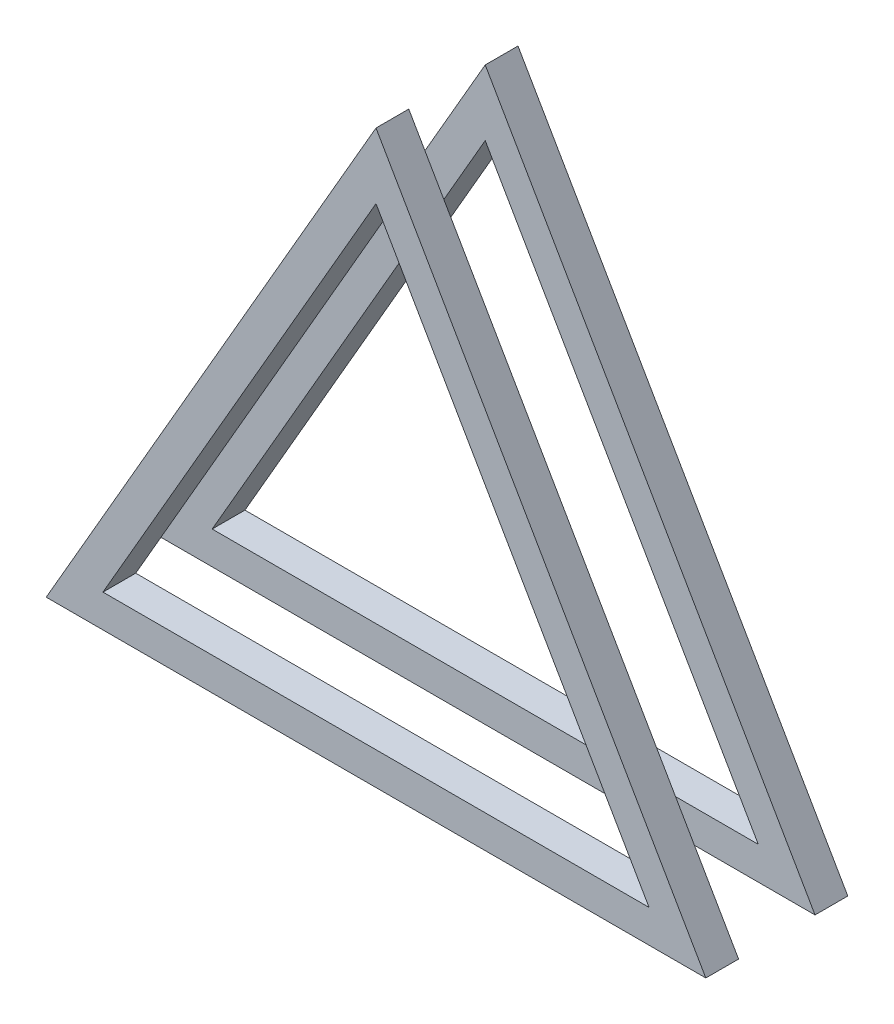
ISO-10303-21;
HEADER;
FILE_DESCRIPTION(('STEP AP214'),'2;1');
FILE_NAME('part.step','',(''),(''),'','','');
FILE_SCHEMA(('AUTOMOTIVE_DESIGN { 1 0 10303 214 1 1 1 1 }'));
ENDSEC;
DATA;
#1=APPLICATION_CONTEXT('core data for automotive mechanical design processes');
#2=APPLICATION_PROTOCOL_DEFINITION('international standard','automotive_design',2000,#1);
#3=PRODUCT_CONTEXT('',#1,'mechanical');
#4=PRODUCT('Part','Part','',(#3));
#5=PRODUCT_RELATED_PRODUCT_CATEGORY('part','',(#4));
#6=PRODUCT_DEFINITION_FORMATION('','',#4);
#7=PRODUCT_DEFINITION_CONTEXT('part definition',#1,'design');
#8=PRODUCT_DEFINITION('design','',#6,#7);
#9=PRODUCT_DEFINITION_SHAPE('','',#8);
#10=(LENGTH_UNIT() NAMED_UNIT(*) SI_UNIT(.MILLI.,.METRE.));
#11=(NAMED_UNIT(*) PLANE_ANGLE_UNIT() SI_UNIT($,.RADIAN.));
#12=(NAMED_UNIT(*) SI_UNIT($,.STERADIAN.) SOLID_ANGLE_UNIT());
#13=UNCERTAINTY_MEASURE_WITH_UNIT(LENGTH_MEASURE(1.E-05),#10,'distance_accuracy_value','');
#14=(GEOMETRIC_REPRESENTATION_CONTEXT(3) GLOBAL_UNCERTAINTY_ASSIGNED_CONTEXT((#13)) GLOBAL_UNIT_ASSIGNED_CONTEXT((#10,
#11,#12)) REPRESENTATION_CONTEXT('',''));
#15=CARTESIAN_POINT('',(0.,0.,0.));
#16=DIRECTION('',(0.,0.,1.));
#17=DIRECTION('',(1.,0.,0.));
#18=AXIS2_PLACEMENT_3D('',#15,#16,#17);
#19=CARTESIAN_POINT('',(0.,0.,-7.));
#20=DIRECTION('',(0.,0.,1.));
#21=DIRECTION('',(1.,0.,0.));
#22=AXIS2_PLACEMENT_3D('',#19,#20,#21);
#23=PLANE('',#22);
#24=DIRECTION('',(1.,0.,0.));
#25=VECTOR('',#24,1.);
#26=CARTESIAN_POINT('',(-5.19615242270663,-3.,-7.));
#27=LINE('',#26,#25);
#28=CARTESIAN_POINT('',(-5.19615242270663,-3.,-7.));
#29=VERTEX_POINT('',#28);
#30=CARTESIAN_POINT('',(55.1961524227066,-3.,-7.));
#31=VERTEX_POINT('',#30);
#32=EDGE_CURVE('E123',#29,#31,#27,.T.);
#33=ORIENTED_EDGE('',*,*,#32,.T.);
#34=DIRECTION('',(-0.5,0.866025403784439,0.));
#35=VECTOR('',#34,1.);
#36=CARTESIAN_POINT('',(55.1961524227066,-3.,-7.));
#37=LINE('',#36,#35);
#38=CARTESIAN_POINT('',(25.,49.3012701892219,-7.));
#39=VERTEX_POINT('',#38);
#40=EDGE_CURVE('E126',#31,#39,#37,.T.);
#41=ORIENTED_EDGE('',*,*,#40,.T.);
#42=DIRECTION('',(-0.5,-0.866025403784439,0.));
#43=VECTOR('',#42,1.);
#44=CARTESIAN_POINT('',(25.,49.3012701892219,-7.));
#45=LINE('',#44,#43);
#46=EDGE_CURVE('E129',#39,#29,#45,.T.);
#47=ORIENTED_EDGE('',*,*,#46,.T.);
#48=EDGE_LOOP('',(#33,#41,#47));
#49=FACE_BOUND('',#48,.T.);
#50=DIRECTION('',(1.,0.,0.));
#51=VECTOR('',#50,1.);
#52=CARTESIAN_POINT('',(0.,0.,-7.));
#53=LINE('',#52,#51);
#54=CARTESIAN_POINT('',(0.,0.,-7.));
#55=VERTEX_POINT('',#54);
#56=CARTESIAN_POINT('',(50.,0.,-7.));
#57=VERTEX_POINT('',#56);
#58=EDGE_CURVE('E104',#55,#57,#53,.T.);
#59=ORIENTED_EDGE('',*,*,#58,.F.);
#60=DIRECTION('',(-0.5,-0.866025403784439,0.));
#61=VECTOR('',#60,1.);
#62=CARTESIAN_POINT('',(25.,43.3012701892219,-7.));
#63=LINE('',#62,#61);
#64=CARTESIAN_POINT('',(25.,43.3012701892219,-7.));
#65=VERTEX_POINT('',#64);
#66=EDGE_CURVE('E96',#65,#55,#63,.T.);
#67=ORIENTED_EDGE('',*,*,#66,.F.);
#68=DIRECTION('',(-0.5,0.866025403784439,0.));
#69=VECTOR('',#68,1.);
#70=CARTESIAN_POINT('',(50.,0.,-7.));
#71=LINE('',#70,#69);
#72=EDGE_CURVE('E113',#57,#65,#71,.T.);
#73=ORIENTED_EDGE('',*,*,#72,.F.);
#74=EDGE_LOOP('',(#59,#67,#73));
#75=FACE_BOUND('',#74,.T.);
#76=ADVANCED_FACE('F43',(#49,#75),#23,.T.);
#77=CARTESIAN_POINT('',(0.,0.,-10.));
#78=DIRECTION('',(0.,0.,1.));
#79=DIRECTION('',(1.,0.,0.));
#80=AXIS2_PLACEMENT_3D('',#77,#78,#79);
#81=PLANE('',#80);
#82=DIRECTION('',(1.,0.,0.));
#83=VECTOR('',#82,1.);
#84=CARTESIAN_POINT('',(-5.19615242270663,-3.,-10.));
#85=LINE('',#84,#83);
#86=CARTESIAN_POINT('',(-5.19615242270663,-3.,-10.));
#87=VERTEX_POINT('',#86);
#88=CARTESIAN_POINT('',(55.1961524227066,-3.,-10.));
#89=VERTEX_POINT('',#88);
#90=EDGE_CURVE('E111',#87,#89,#85,.T.);
#91=ORIENTED_EDGE('',*,*,#90,.F.);
#92=DIRECTION('',(-0.5,-0.866025403784439,0.));
#93=VECTOR('',#92,1.);
#94=CARTESIAN_POINT('',(25.,49.3012701892219,-10.));
#95=LINE('',#94,#93);
#96=CARTESIAN_POINT('',(25.,49.3012701892219,-10.));
#97=VERTEX_POINT('',#96);
#98=EDGE_CURVE('E127',#97,#87,#95,.T.);
#99=ORIENTED_EDGE('',*,*,#98,.F.);
#100=DIRECTION('',(-0.5,0.866025403784439,0.));
#101=VECTOR('',#100,1.);
#102=CARTESIAN_POINT('',(55.1961524227066,-3.,-10.));
#103=LINE('',#102,#101);
#104=EDGE_CURVE('E134',#89,#97,#103,.T.);
#105=ORIENTED_EDGE('',*,*,#104,.F.);
#106=EDGE_LOOP('',(#91,#99,#105));
#107=FACE_BOUND('',#106,.T.);
#108=DIRECTION('',(-0.5,-0.866025403784439,0.));
#109=VECTOR('',#108,1.);
#110=CARTESIAN_POINT('',(25.,43.3012701892219,-10.));
#111=LINE('',#110,#109);
#112=CARTESIAN_POINT('',(25.,43.3012701892219,-10.));
#113=VERTEX_POINT('',#112);
#114=CARTESIAN_POINT('',(0.,0.,-10.));
#115=VERTEX_POINT('',#114);
#116=EDGE_CURVE('E66',#113,#115,#111,.T.);
#117=ORIENTED_EDGE('',*,*,#116,.T.);
#118=DIRECTION('',(1.,0.,0.));
#119=VECTOR('',#118,1.);
#120=CARTESIAN_POINT('',(0.,0.,-10.));
#121=LINE('',#120,#119);
#122=CARTESIAN_POINT('',(50.,0.,-10.));
#123=VERTEX_POINT('',#122);
#124=EDGE_CURVE('E110',#115,#123,#121,.T.);
#125=ORIENTED_EDGE('',*,*,#124,.T.);
#126=DIRECTION('',(-0.5,0.866025403784439,0.));
#127=VECTOR('',#126,1.);
#128=CARTESIAN_POINT('',(50.,0.,-10.));
#129=LINE('',#128,#127);
#130=EDGE_CURVE('E105',#123,#113,#129,.T.);
#131=ORIENTED_EDGE('',*,*,#130,.T.);
#132=EDGE_LOOP('',(#117,#125,#131));
#133=FACE_BOUND('',#132,.T.);
#134=ADVANCED_FACE('F148',(#107,#133),#81,.F.);
#135=CARTESIAN_POINT('',(-5.19615242270663,-3.,-7.));
#136=DIRECTION('',(0.,1.,0.));
#137=DIRECTION('',(0.,0.,1.));
#138=AXIS2_PLACEMENT_3D('',#135,#136,#137);
#139=PLANE('',#138);
#140=ORIENTED_EDGE('',*,*,#90,.T.);
#141=DIRECTION('',(0.,0.,-1.));
#142=VECTOR('',#141,1.);
#143=CARTESIAN_POINT('',(55.1961524227066,-3.,-7.));
#144=LINE('',#143,#142);
#145=EDGE_CURVE('E12',#31,#89,#144,.T.);
#146=ORIENTED_EDGE('',*,*,#145,.F.);
#147=ORIENTED_EDGE('',*,*,#32,.F.);
#148=DIRECTION('',(0.,0.,-1.));
#149=VECTOR('',#148,1.);
#150=CARTESIAN_POINT('',(-5.19615242270663,-3.,-7.));
#151=LINE('',#150,#149);
#152=EDGE_CURVE('E131',#29,#87,#151,.T.);
#153=ORIENTED_EDGE('',*,*,#152,.T.);
#154=EDGE_LOOP('',(#140,#146,#147,#153));
#155=FACE_BOUND('',#154,.T.);
#156=ADVANCED_FACE('F45',(#155),#139,.F.);
#157=CARTESIAN_POINT('',(55.1961524227066,-3.,-7.));
#158=DIRECTION('',(-0.866025403784439,-0.5,0.));
#159=DIRECTION('',(0.5,-0.866025403784439,0.));
#160=AXIS2_PLACEMENT_3D('',#157,#158,#159);
#161=PLANE('',#160);
#162=ORIENTED_EDGE('',*,*,#104,.T.);
#163=DIRECTION('',(0.,0.,-1.));
#164=VECTOR('',#163,1.);
#165=CARTESIAN_POINT('',(25.,49.3012701892219,-7.));
#166=LINE('',#165,#164);
#167=EDGE_CURVE('E51',#39,#97,#166,.T.);
#168=ORIENTED_EDGE('',*,*,#167,.F.);
#169=ORIENTED_EDGE('',*,*,#40,.F.);
#170=ORIENTED_EDGE('',*,*,#145,.T.);
#171=EDGE_LOOP('',(#162,#168,#169,#170));
#172=FACE_BOUND('',#171,.T.);
#173=ADVANCED_FACE('F154',(#172),#161,.F.);
#174=CARTESIAN_POINT('',(25.,49.3012701892219,-7.));
#175=DIRECTION('',(0.866025403784439,-0.5,0.));
#176=DIRECTION('',(0.5,0.866025403784439,0.));
#177=AXIS2_PLACEMENT_3D('',#174,#175,#176);
#178=PLANE('',#177);
#179=ORIENTED_EDGE('',*,*,#98,.T.);
#180=ORIENTED_EDGE('',*,*,#152,.F.);
#181=ORIENTED_EDGE('',*,*,#46,.F.);
#182=ORIENTED_EDGE('',*,*,#167,.T.);
#183=EDGE_LOOP('',(#179,#180,#181,#182));
#184=FACE_BOUND('',#183,.T.);
#185=ADVANCED_FACE('F143',(#184),#178,.F.);
#186=CARTESIAN_POINT('',(25.,43.3012701892219,-7.));
#187=DIRECTION('',(0.866025403784439,-0.5,0.));
#188=DIRECTION('',(0.5,0.866025403784439,0.));
#189=AXIS2_PLACEMENT_3D('',#186,#187,#188);
#190=PLANE('',#189);
#191=ORIENTED_EDGE('',*,*,#116,.F.);
#192=DIRECTION('',(0.,0.,-1.));
#193=VECTOR('',#192,1.);
#194=CARTESIAN_POINT('',(25.,43.3012701892219,-7.));
#195=LINE('',#194,#193);
#196=EDGE_CURVE('E100',#65,#113,#195,.T.);
#197=ORIENTED_EDGE('',*,*,#196,.F.);
#198=ORIENTED_EDGE('',*,*,#66,.T.);
#199=DIRECTION('',(0.,0.,-1.));
#200=VECTOR('',#199,1.);
#201=CARTESIAN_POINT('',(0.,0.,-7.));
#202=LINE('',#201,#200);
#203=EDGE_CURVE('E99',#55,#115,#202,.T.);
#204=ORIENTED_EDGE('',*,*,#203,.T.);
#205=EDGE_LOOP('',(#191,#197,#198,#204));
#206=FACE_BOUND('',#205,.T.);
#207=ADVANCED_FACE('F98',(#206),#190,.T.);
#208=CARTESIAN_POINT('',(0.,0.,-7.));
#209=DIRECTION('',(0.,1.,0.));
#210=DIRECTION('',(0.,0.,1.));
#211=AXIS2_PLACEMENT_3D('',#208,#209,#210);
#212=PLANE('',#211);
#213=ORIENTED_EDGE('',*,*,#124,.F.);
#214=ORIENTED_EDGE('',*,*,#203,.F.);
#215=ORIENTED_EDGE('',*,*,#58,.T.);
#216=DIRECTION('',(0.,0.,-1.));
#217=VECTOR('',#216,1.);
#218=CARTESIAN_POINT('',(50.,0.,-7.));
#219=LINE('',#218,#217);
#220=EDGE_CURVE('E58',#57,#123,#219,.T.);
#221=ORIENTED_EDGE('',*,*,#220,.T.);
#222=EDGE_LOOP('',(#213,#214,#215,#221));
#223=FACE_BOUND('',#222,.T.);
#224=ADVANCED_FACE('F108',(#223),#212,.T.);
#225=CARTESIAN_POINT('',(50.,0.,-7.));
#226=DIRECTION('',(-0.866025403784439,-0.5,0.));
#227=DIRECTION('',(0.5,-0.866025403784439,0.));
#228=AXIS2_PLACEMENT_3D('',#225,#226,#227);
#229=PLANE('',#228);
#230=ORIENTED_EDGE('',*,*,#130,.F.);
#231=ORIENTED_EDGE('',*,*,#220,.F.);
#232=ORIENTED_EDGE('',*,*,#72,.T.);
#233=ORIENTED_EDGE('',*,*,#196,.T.);
#234=EDGE_LOOP('',(#230,#231,#232,#233));
#235=FACE_BOUND('',#234,.T.);
#236=ADVANCED_FACE('F172',(#235),#229,.T.);
#237=CLOSED_SHELL('',(#76,#134,#156,#173,#185,#207,#224,#236));
#238=MANIFOLD_SOLID_BREP('B2',#237);
#239=CARTESIAN_POINT('',(0.,0.,3.));
#240=DIRECTION('',(0.,0.,1.));
#241=DIRECTION('',(1.,0.,0.));
#242=AXIS2_PLACEMENT_3D('',#239,#240,#241);
#243=PLANE('',#242);
#244=DIRECTION('',(1.,0.,0.));
#245=VECTOR('',#244,1.);
#246=CARTESIAN_POINT('',(-5.19615242270664,-3.,3.));
#247=LINE('',#246,#245);
#248=CARTESIAN_POINT('',(-5.19615242270664,-3.,3.));
#249=VERTEX_POINT('',#248);
#250=CARTESIAN_POINT('',(55.1961524227066,-3.,3.));
#251=VERTEX_POINT('',#250);
#252=EDGE_CURVE('E301',#249,#251,#247,.T.);
#253=ORIENTED_EDGE('',*,*,#252,.T.);
#254=DIRECTION('',(-0.5,0.866025403784439,0.));
#255=VECTOR('',#254,1.);
#256=CARTESIAN_POINT('',(55.1961524227066,-3.,3.));
#257=LINE('',#256,#255);
#258=CARTESIAN_POINT('',(25.,49.3012701892219,3.));
#259=VERTEX_POINT('',#258);
#260=EDGE_CURVE('E304',#251,#259,#257,.T.);
#261=ORIENTED_EDGE('',*,*,#260,.T.);
#262=DIRECTION('',(-0.5,-0.866025403784439,0.));
#263=VECTOR('',#262,1.);
#264=CARTESIAN_POINT('',(25.,49.3012701892219,3.));
#265=LINE('',#264,#263);
#266=EDGE_CURVE('E307',#259,#249,#265,.T.);
#267=ORIENTED_EDGE('',*,*,#266,.T.);
#268=EDGE_LOOP('',(#253,#261,#267));
#269=FACE_BOUND('',#268,.T.);
#270=DIRECTION('',(1.,0.,0.));
#271=VECTOR('',#270,1.);
#272=CARTESIAN_POINT('',(0.,0.,3.));
#273=LINE('',#272,#271);
#274=CARTESIAN_POINT('',(0.,0.,3.));
#275=VERTEX_POINT('',#274);
#276=CARTESIAN_POINT('',(50.,0.,3.));
#277=VERTEX_POINT('',#276);
#278=EDGE_CURVE('E282',#275,#277,#273,.T.);
#279=ORIENTED_EDGE('',*,*,#278,.F.);
#280=DIRECTION('',(-0.5,-0.866025403784439,0.));
#281=VECTOR('',#280,1.);
#282=CARTESIAN_POINT('',(25.,43.3012701892219,3.));
#283=LINE('',#282,#281);
#284=CARTESIAN_POINT('',(25.,43.3012701892219,3.));
#285=VERTEX_POINT('',#284);
#286=EDGE_CURVE('E274',#285,#275,#283,.T.);
#287=ORIENTED_EDGE('',*,*,#286,.F.);
#288=DIRECTION('',(-0.5,0.866025403784439,0.));
#289=VECTOR('',#288,1.);
#290=CARTESIAN_POINT('',(50.,0.,3.));
#291=LINE('',#290,#289);
#292=EDGE_CURVE('E291',#277,#285,#291,.T.);
#293=ORIENTED_EDGE('',*,*,#292,.F.);
#294=EDGE_LOOP('',(#279,#287,#293));
#295=FACE_BOUND('',#294,.T.);
#296=ADVANCED_FACE('F221',(#269,#295),#243,.T.);
#297=CARTESIAN_POINT('',(0.,0.,0.));
#298=DIRECTION('',(0.,0.,1.));
#299=DIRECTION('',(1.,0.,0.));
#300=AXIS2_PLACEMENT_3D('',#297,#298,#299);
#301=PLANE('',#300);
#302=DIRECTION('',(1.,0.,0.));
#303=VECTOR('',#302,1.);
#304=CARTESIAN_POINT('',(-5.19615242270664,-3.,0.));
#305=LINE('',#304,#303);
#306=CARTESIAN_POINT('',(-5.19615242270664,-3.,0.));
#307=VERTEX_POINT('',#306);
#308=CARTESIAN_POINT('',(55.1961524227066,-3.,0.));
#309=VERTEX_POINT('',#308);
#310=EDGE_CURVE('E289',#307,#309,#305,.T.);
#311=ORIENTED_EDGE('',*,*,#310,.F.);
#312=DIRECTION('',(-0.5,-0.866025403784439,0.));
#313=VECTOR('',#312,1.);
#314=CARTESIAN_POINT('',(25.,49.3012701892219,0.));
#315=LINE('',#314,#313);
#316=CARTESIAN_POINT('',(25.,49.3012701892219,0.));
#317=VERTEX_POINT('',#316);
#318=EDGE_CURVE('E305',#317,#307,#315,.T.);
#319=ORIENTED_EDGE('',*,*,#318,.F.);
#320=DIRECTION('',(-0.5,0.866025403784439,0.));
#321=VECTOR('',#320,1.);
#322=CARTESIAN_POINT('',(55.1961524227066,-3.,0.));
#323=LINE('',#322,#321);
#324=EDGE_CURVE('E312',#309,#317,#323,.T.);
#325=ORIENTED_EDGE('',*,*,#324,.F.);
#326=EDGE_LOOP('',(#311,#319,#325));
#327=FACE_BOUND('',#326,.T.);
#328=DIRECTION('',(-0.5,-0.866025403784439,0.));
#329=VECTOR('',#328,1.);
#330=CARTESIAN_POINT('',(25.,43.3012701892219,0.));
#331=LINE('',#330,#329);
#332=CARTESIAN_POINT('',(25.,43.3012701892219,0.));
#333=VERTEX_POINT('',#332);
#334=CARTESIAN_POINT('',(0.,0.,0.));
#335=VERTEX_POINT('',#334);
#336=EDGE_CURVE('E244',#333,#335,#331,.T.);
#337=ORIENTED_EDGE('',*,*,#336,.T.);
#338=DIRECTION('',(1.,0.,0.));
#339=VECTOR('',#338,1.);
#340=CARTESIAN_POINT('',(0.,0.,0.));
#341=LINE('',#340,#339);
#342=CARTESIAN_POINT('',(50.,0.,0.));
#343=VERTEX_POINT('',#342);
#344=EDGE_CURVE('E288',#335,#343,#341,.T.);
#345=ORIENTED_EDGE('',*,*,#344,.T.);
#346=DIRECTION('',(-0.5,0.866025403784439,0.));
#347=VECTOR('',#346,1.);
#348=CARTESIAN_POINT('',(50.,0.,0.));
#349=LINE('',#348,#347);
#350=EDGE_CURVE('E283',#343,#333,#349,.T.);
#351=ORIENTED_EDGE('',*,*,#350,.T.);
#352=EDGE_LOOP('',(#337,#345,#351));
#353=FACE_BOUND('',#352,.T.);
#354=ADVANCED_FACE('F326',(#327,#353),#301,.F.);
#355=CARTESIAN_POINT('',(-5.19615242270664,-3.,3.));
#356=DIRECTION('',(0.,1.,0.));
#357=DIRECTION('',(0.,0.,1.));
#358=AXIS2_PLACEMENT_3D('',#355,#356,#357);
#359=PLANE('',#358);
#360=ORIENTED_EDGE('',*,*,#310,.T.);
#361=DIRECTION('',(0.,0.,-1.));
#362=VECTOR('',#361,1.);
#363=CARTESIAN_POINT('',(55.1961524227066,-3.,3.));
#364=LINE('',#363,#362);
#365=EDGE_CURVE('E41',#251,#309,#364,.T.);
#366=ORIENTED_EDGE('',*,*,#365,.F.);
#367=ORIENTED_EDGE('',*,*,#252,.F.);
#368=DIRECTION('',(0.,0.,-1.));
#369=VECTOR('',#368,1.);
#370=CARTESIAN_POINT('',(-5.19615242270664,-3.,3.));
#371=LINE('',#370,#369);
#372=EDGE_CURVE('E309',#249,#307,#371,.T.);
#373=ORIENTED_EDGE('',*,*,#372,.T.);
#374=EDGE_LOOP('',(#360,#366,#367,#373));
#375=FACE_BOUND('',#374,.T.);
#376=ADVANCED_FACE('F223',(#375),#359,.F.);
#377=CARTESIAN_POINT('',(55.1961524227066,-3.,3.));
#378=DIRECTION('',(-0.866025403784439,-0.5,0.));
#379=DIRECTION('',(0.5,-0.866025403784439,0.));
#380=AXIS2_PLACEMENT_3D('',#377,#378,#379);
#381=PLANE('',#380);
#382=ORIENTED_EDGE('',*,*,#324,.T.);
#383=DIRECTION('',(0.,0.,-1.));
#384=VECTOR('',#383,1.);
#385=CARTESIAN_POINT('',(25.,49.3012701892219,3.));
#386=LINE('',#385,#384);
#387=EDGE_CURVE('E229',#259,#317,#386,.T.);
#388=ORIENTED_EDGE('',*,*,#387,.F.);
#389=ORIENTED_EDGE('',*,*,#260,.F.);
#390=ORIENTED_EDGE('',*,*,#365,.T.);
#391=EDGE_LOOP('',(#382,#388,#389,#390));
#392=FACE_BOUND('',#391,.T.);
#393=ADVANCED_FACE('F332',(#392),#381,.F.);
#394=CARTESIAN_POINT('',(25.,49.3012701892219,3.));
#395=DIRECTION('',(0.866025403784439,-0.5,0.));
#396=DIRECTION('',(0.5,0.866025403784439,0.));
#397=AXIS2_PLACEMENT_3D('',#394,#395,#396);
#398=PLANE('',#397);
#399=ORIENTED_EDGE('',*,*,#318,.T.);
#400=ORIENTED_EDGE('',*,*,#372,.F.);
#401=ORIENTED_EDGE('',*,*,#266,.F.);
#402=ORIENTED_EDGE('',*,*,#387,.T.);
#403=EDGE_LOOP('',(#399,#400,#401,#402));
#404=FACE_BOUND('',#403,.T.);
#405=ADVANCED_FACE('F321',(#404),#398,.F.);
#406=CARTESIAN_POINT('',(25.,43.3012701892219,3.));
#407=DIRECTION('',(0.866025403784439,-0.5,0.));
#408=DIRECTION('',(0.5,0.866025403784439,0.));
#409=AXIS2_PLACEMENT_3D('',#406,#407,#408);
#410=PLANE('',#409);
#411=ORIENTED_EDGE('',*,*,#336,.F.);
#412=DIRECTION('',(0.,0.,-1.));
#413=VECTOR('',#412,1.);
#414=CARTESIAN_POINT('',(25.,43.3012701892219,3.));
#415=LINE('',#414,#413);
#416=EDGE_CURVE('E278',#285,#333,#415,.T.);
#417=ORIENTED_EDGE('',*,*,#416,.F.);
#418=ORIENTED_EDGE('',*,*,#286,.T.);
#419=DIRECTION('',(0.,0.,-1.));
#420=VECTOR('',#419,1.);
#421=CARTESIAN_POINT('',(0.,0.,3.));
#422=LINE('',#421,#420);
#423=EDGE_CURVE('E277',#275,#335,#422,.T.);
#424=ORIENTED_EDGE('',*,*,#423,.T.);
#425=EDGE_LOOP('',(#411,#417,#418,#424));
#426=FACE_BOUND('',#425,.T.);
#427=ADVANCED_FACE('F276',(#426),#410,.T.);
#428=CARTESIAN_POINT('',(0.,0.,3.));
#429=DIRECTION('',(0.,1.,0.));
#430=DIRECTION('',(0.,0.,1.));
#431=AXIS2_PLACEMENT_3D('',#428,#429,#430);
#432=PLANE('',#431);
#433=ORIENTED_EDGE('',*,*,#344,.F.);
#434=ORIENTED_EDGE('',*,*,#423,.F.);
#435=ORIENTED_EDGE('',*,*,#278,.T.);
#436=DIRECTION('',(0.,0.,-1.));
#437=VECTOR('',#436,1.);
#438=CARTESIAN_POINT('',(50.,0.,3.));
#439=LINE('',#438,#437);
#440=EDGE_CURVE('E236',#277,#343,#439,.T.);
#441=ORIENTED_EDGE('',*,*,#440,.T.);
#442=EDGE_LOOP('',(#433,#434,#435,#441));
#443=FACE_BOUND('',#442,.T.);
#444=ADVANCED_FACE('F286',(#443),#432,.T.);
#445=CARTESIAN_POINT('',(50.,0.,3.));
#446=DIRECTION('',(-0.866025403784439,-0.5,0.));
#447=DIRECTION('',(0.5,-0.866025403784439,0.));
#448=AXIS2_PLACEMENT_3D('',#445,#446,#447);
#449=PLANE('',#448);
#450=ORIENTED_EDGE('',*,*,#350,.F.);
#451=ORIENTED_EDGE('',*,*,#440,.F.);
#452=ORIENTED_EDGE('',*,*,#292,.T.);
#453=ORIENTED_EDGE('',*,*,#416,.T.);
#454=EDGE_LOOP('',(#450,#451,#452,#453));
#455=FACE_BOUND('',#454,.T.);
#456=ADVANCED_FACE('F350',(#455),#449,.T.);
#457=CLOSED_SHELL('',(#296,#354,#376,#393,#405,#427,#444,#456));
#458=MANIFOLD_SOLID_BREP('B6',#457);
#459=ADVANCED_BREP_SHAPE_REPRESENTATION('',(#18,#238,#458),#14);
#460=SHAPE_DEFINITION_REPRESENTATION(#9,#459);
ENDSEC;
END-ISO-10303-21;
